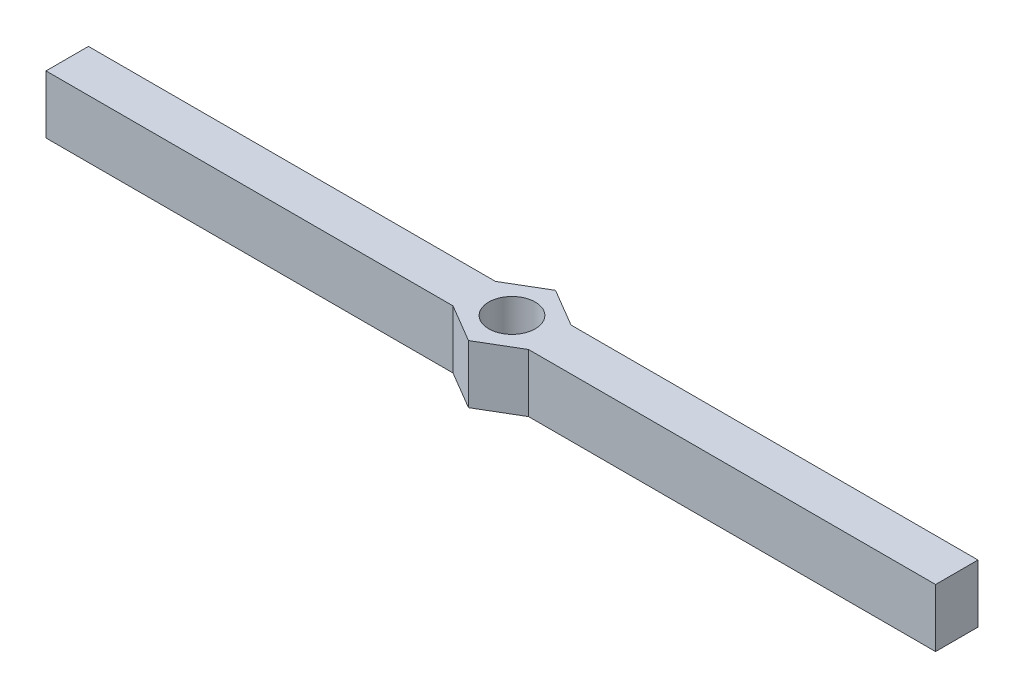
ISO-10303-21;
HEADER;
FILE_DESCRIPTION(('STEP AP214'),'2;1');
FILE_NAME('part.step','',(''),(''),'','','');
FILE_SCHEMA(('AUTOMOTIVE_DESIGN { 1 0 10303 214 1 1 1 1 }'));
ENDSEC;
DATA;
#1=APPLICATION_CONTEXT('core data for automotive mechanical design processes');
#2=APPLICATION_PROTOCOL_DEFINITION('international standard','automotive_design',2000,#1);
#3=PRODUCT_CONTEXT('',#1,'mechanical');
#4=PRODUCT('Part','Part','',(#3));
#5=PRODUCT_RELATED_PRODUCT_CATEGORY('part','',(#4));
#6=PRODUCT_DEFINITION_FORMATION('','',#4);
#7=PRODUCT_DEFINITION_CONTEXT('part definition',#1,'design');
#8=PRODUCT_DEFINITION('design','',#6,#7);
#9=PRODUCT_DEFINITION_SHAPE('','',#8);
#10=(LENGTH_UNIT() NAMED_UNIT(*) SI_UNIT(.MILLI.,.METRE.));
#11=(NAMED_UNIT(*) PLANE_ANGLE_UNIT() SI_UNIT($,.RADIAN.));
#12=(NAMED_UNIT(*) SI_UNIT($,.STERADIAN.) SOLID_ANGLE_UNIT());
#13=UNCERTAINTY_MEASURE_WITH_UNIT(LENGTH_MEASURE(1.E-05),#10,'distance_accuracy_value','');
#14=(GEOMETRIC_REPRESENTATION_CONTEXT(3) GLOBAL_UNCERTAINTY_ASSIGNED_CONTEXT((#13)) GLOBAL_UNIT_ASSIGNED_CONTEXT((#10,
#11,#12)) REPRESENTATION_CONTEXT('',''));
#15=CARTESIAN_POINT('',(0.,0.,0.));
#16=DIRECTION('',(0.,0.,1.));
#17=DIRECTION('',(1.,0.,0.));
#18=AXIS2_PLACEMENT_3D('',#15,#16,#17);
#19=CARTESIAN_POINT('',(-76.5008249027898,10.,-2.03693710594803E-12));
#20=DIRECTION('',(-1.,0.,0.));
#21=DIRECTION('',(0.,0.,1.));
#22=AXIS2_PLACEMENT_3D('',#19,#20,#21);
#23=PLANE('',#22);
#24=DIRECTION('',(0.,0.,-1.));
#25=VECTOR('',#24,1.);
#26=CARTESIAN_POINT('',(-76.5008249027898,0.,-2.03693710594803E-12));
#27=LINE('',#26,#25);
#28=CARTESIAN_POINT('',(-76.5008249027899,0.,3.64843641178938));
#29=VERTEX_POINT('',#28);
#30=CARTESIAN_POINT('',(-76.5008249027897,0.,-3.6484364117895));
#31=VERTEX_POINT('',#30);
#32=EDGE_CURVE('E148',#29,#31,#27,.T.);
#33=ORIENTED_EDGE('',*,*,#32,.F.);
#34=DIRECTION('',(0.,-1.,0.));
#35=VECTOR('',#34,1.);
#36=CARTESIAN_POINT('',(-76.5008249027899,10.,3.64843641178938));
#37=LINE('',#36,#35);
#38=CARTESIAN_POINT('',(-76.5008249027899,10.,3.64843641178938));
#39=VERTEX_POINT('',#38);
#40=EDGE_CURVE('E11',#39,#29,#37,.T.);
#41=ORIENTED_EDGE('',*,*,#40,.F.);
#42=DIRECTION('',(0.,0.,-1.));
#43=VECTOR('',#42,1.);
#44=CARTESIAN_POINT('',(-76.5008249027898,10.,-2.03693710594803E-12));
#45=LINE('',#44,#43);
#46=CARTESIAN_POINT('',(-76.5008249027897,10.,-3.6484364117895));
#47=VERTEX_POINT('',#46);
#48=EDGE_CURVE('E175',#39,#47,#45,.T.);
#49=ORIENTED_EDGE('',*,*,#48,.T.);
#50=DIRECTION('',(0.,-1.,0.));
#51=VECTOR('',#50,1.);
#52=CARTESIAN_POINT('',(-76.5008249027897,10.,-3.6484364117895));
#53=LINE('',#52,#51);
#54=EDGE_CURVE('E95',#47,#31,#53,.T.);
#55=ORIENTED_EDGE('',*,*,#54,.T.);
#56=EDGE_LOOP('',(#33,#41,#49,#55));
#57=FACE_BOUND('',#56,.T.);
#58=ADVANCED_FACE('F39',(#57),#23,.T.);
#59=CARTESIAN_POINT('',(0.,10.,3.6484364117913));
#60=DIRECTION('',(0.,0.,1.));
#61=DIRECTION('',(1.,0.,0.));
#62=AXIS2_PLACEMENT_3D('',#59,#60,#61);
#63=PLANE('',#62);
#64=DIRECTION('',(-1.,0.,0.));
#65=VECTOR('',#64,1.);
#66=CARTESIAN_POINT('',(0.,0.,3.6484364117913));
#67=LINE('',#66,#65);
#68=CARTESIAN_POINT('',(-6.50082490279077,0.,3.64843641178945));
#69=VERTEX_POINT('',#68);
#70=EDGE_CURVE('E151',#69,#29,#67,.T.);
#71=ORIENTED_EDGE('',*,*,#70,.F.);
#72=DIRECTION('',(0.,-1.,0.));
#73=VECTOR('',#72,1.);
#74=CARTESIAN_POINT('',(-6.50082490279077,10.,3.64843641178945));
#75=LINE('',#74,#73);
#76=CARTESIAN_POINT('',(-6.50082490279077,10.,3.64843641178945));
#77=VERTEX_POINT('',#76);
#78=EDGE_CURVE('E47',#77,#69,#75,.T.);
#79=ORIENTED_EDGE('',*,*,#78,.F.);
#80=DIRECTION('',(-1.,0.,0.));
#81=VECTOR('',#80,1.);
#82=CARTESIAN_POINT('',(0.,10.,3.6484364117913));
#83=LINE('',#82,#81);
#84=EDGE_CURVE('E204',#77,#39,#83,.T.);
#85=ORIENTED_EDGE('',*,*,#84,.T.);
#86=ORIENTED_EDGE('',*,*,#40,.T.);
#87=EDGE_LOOP('',(#71,#79,#85,#86));
#88=FACE_BOUND('',#87,.T.);
#89=ADVANCED_FACE('F203',(#88),#63,.T.);
#90=CARTESIAN_POINT('',(-3.274592558863,10.,5.55146497654283));
#91=DIRECTION('',(0.508060035822539,0.,-0.861321658847611));
#92=DIRECTION('',(-0.861321658847611,0.,-0.508060035822539));
#93=AXIS2_PLACEMENT_3D('',#90,#91,#92);
#94=PLANE('',#93);
#95=DIRECTION('',(0.861321658847611,0.,0.508060035822539));
#96=VECTOR('',#95,1.);
#97=CARTESIAN_POINT('',(-3.274592558863,0.,5.55146497654283));
#98=LINE('',#97,#96);
#99=CARTESIAN_POINT('',(0.,0.,7.48301934496086));
#100=VERTEX_POINT('',#99);
#101=EDGE_CURVE('E154',#69,#100,#98,.T.);
#102=ORIENTED_EDGE('',*,*,#101,.T.);
#103=DIRECTION('',(0.,-1.,0.));
#104=VECTOR('',#103,1.);
#105=CARTESIAN_POINT('',(0.,10.,7.48301934496086));
#106=LINE('',#105,#104);
#107=CARTESIAN_POINT('',(0.,10.,7.48301934496086));
#108=VERTEX_POINT('',#107);
#109=EDGE_CURVE('E186',#108,#100,#106,.T.);
#110=ORIENTED_EDGE('',*,*,#109,.F.);
#111=DIRECTION('',(0.861321658847611,0.,0.508060035822539));
#112=VECTOR('',#111,1.);
#113=CARTESIAN_POINT('',(-3.274592558863,10.,5.55146497654283));
#114=LINE('',#113,#112);
#115=EDGE_CURVE('E193',#77,#108,#114,.T.);
#116=ORIENTED_EDGE('',*,*,#115,.F.);
#117=ORIENTED_EDGE('',*,*,#78,.T.);
#118=EDGE_LOOP('',(#102,#110,#116,#117));
#119=FACE_BOUND('',#118,.T.);
#120=ADVANCED_FACE('F191',(#119),#94,.F.);
#121=CARTESIAN_POINT('',(3.274592558863,10.,5.55146497654283));
#122=DIRECTION('',(-0.50806003582254,0.,-0.861321658847611));
#123=DIRECTION('',(-0.861321658847611,0.,0.50806003582254));
#124=AXIS2_PLACEMENT_3D('',#121,#122,#123);
#125=PLANE('',#124);
#126=DIRECTION('',(0.861321658847611,0.,-0.50806003582254));
#127=VECTOR('',#126,1.);
#128=CARTESIAN_POINT('',(3.274592558863,0.,5.55146497654283));
#129=LINE('',#128,#127);
#130=CARTESIAN_POINT('',(6.50082490279077,0.,3.64843641178944));
#131=VERTEX_POINT('',#130);
#132=EDGE_CURVE('E156',#100,#131,#129,.T.);
#133=ORIENTED_EDGE('',*,*,#132,.T.);
#134=DIRECTION('',(0.,-1.,0.));
#135=VECTOR('',#134,1.);
#136=CARTESIAN_POINT('',(6.50082490279077,10.,3.64843641178944));
#137=LINE('',#136,#135);
#138=CARTESIAN_POINT('',(6.50082490279077,10.,3.64843641178944));
#139=VERTEX_POINT('',#138);
#140=EDGE_CURVE('E183',#139,#131,#137,.T.);
#141=ORIENTED_EDGE('',*,*,#140,.F.);
#142=DIRECTION('',(0.861321658847611,0.,-0.50806003582254));
#143=VECTOR('',#142,1.);
#144=CARTESIAN_POINT('',(3.274592558863,10.,5.55146497654283));
#145=LINE('',#144,#143);
#146=EDGE_CURVE('E210',#108,#139,#145,.T.);
#147=ORIENTED_EDGE('',*,*,#146,.F.);
#148=ORIENTED_EDGE('',*,*,#109,.T.);
#149=EDGE_LOOP('',(#133,#141,#147,#148));
#150=FACE_BOUND('',#149,.T.);
#151=ADVANCED_FACE('F229',(#150),#125,.F.);
#152=CARTESIAN_POINT('',(0.,10.,3.64843641178944));
#153=DIRECTION('',(0.,0.,-1.));
#154=DIRECTION('',(-1.,0.,0.));
#155=AXIS2_PLACEMENT_3D('',#152,#153,#154);
#156=PLANE('',#155);
#157=DIRECTION('',(1.,0.,0.));
#158=VECTOR('',#157,1.);
#159=CARTESIAN_POINT('',(0.,0.,3.64843641178944));
#160=LINE('',#159,#158);
#161=CARTESIAN_POINT('',(76.5008249027908,0.,3.64843641178944));
#162=VERTEX_POINT('',#161);
#163=EDGE_CURVE('E158',#131,#162,#160,.T.);
#164=ORIENTED_EDGE('',*,*,#163,.T.);
#165=DIRECTION('',(0.,-1.,0.));
#166=VECTOR('',#165,1.);
#167=CARTESIAN_POINT('',(76.5008249027908,10.,3.64843641178944));
#168=LINE('',#167,#166);
#169=CARTESIAN_POINT('',(76.5008249027908,10.,3.64843641178944));
#170=VERTEX_POINT('',#169);
#171=EDGE_CURVE('E181',#170,#162,#168,.T.);
#172=ORIENTED_EDGE('',*,*,#171,.F.);
#173=DIRECTION('',(1.,0.,0.));
#174=VECTOR('',#173,1.);
#175=CARTESIAN_POINT('',(0.,10.,3.64843641178944));
#176=LINE('',#175,#174);
#177=EDGE_CURVE('E212',#139,#170,#176,.T.);
#178=ORIENTED_EDGE('',*,*,#177,.F.);
#179=ORIENTED_EDGE('',*,*,#140,.T.);
#180=EDGE_LOOP('',(#164,#172,#178,#179));
#181=FACE_BOUND('',#180,.T.);
#182=ADVANCED_FACE('F225',(#181),#156,.F.);
#183=CARTESIAN_POINT('',(76.5008249027908,10.,0.));
#184=DIRECTION('',(1.,0.,0.));
#185=DIRECTION('',(0.,0.,-1.));
#186=AXIS2_PLACEMENT_3D('',#183,#184,#185);
#187=PLANE('',#186);
#188=DIRECTION('',(0.,0.,1.));
#189=VECTOR('',#188,1.);
#190=CARTESIAN_POINT('',(76.5008249027908,0.,0.));
#191=LINE('',#190,#189);
#192=CARTESIAN_POINT('',(76.5008249027908,0.,-3.64843641178944));
#193=VERTEX_POINT('',#192);
#194=EDGE_CURVE('E161',#193,#162,#191,.T.);
#195=ORIENTED_EDGE('',*,*,#194,.F.);
#196=DIRECTION('',(0.,-1.,0.));
#197=VECTOR('',#196,1.);
#198=CARTESIAN_POINT('',(76.5008249027908,10.,-3.64843641178944));
#199=LINE('',#198,#197);
#200=CARTESIAN_POINT('',(76.5008249027908,10.,-3.64843641178944));
#201=VERTEX_POINT('',#200);
#202=EDGE_CURVE('E179',#201,#193,#199,.T.);
#203=ORIENTED_EDGE('',*,*,#202,.F.);
#204=DIRECTION('',(0.,0.,1.));
#205=VECTOR('',#204,1.);
#206=CARTESIAN_POINT('',(76.5008249027908,10.,0.));
#207=LINE('',#206,#205);
#208=EDGE_CURVE('E214',#201,#170,#207,.T.);
#209=ORIENTED_EDGE('',*,*,#208,.T.);
#210=ORIENTED_EDGE('',*,*,#171,.T.);
#211=EDGE_LOOP('',(#195,#203,#209,#210));
#212=FACE_BOUND('',#211,.T.);
#213=ADVANCED_FACE('F221',(#212),#187,.T.);
#214=CARTESIAN_POINT('',(0.,10.,-3.64843641178945));
#215=DIRECTION('',(0.,0.,-1.));
#216=DIRECTION('',(-1.,0.,0.));
#217=AXIS2_PLACEMENT_3D('',#214,#215,#216);
#218=PLANE('',#217);
#219=DIRECTION('',(1.,0.,0.));
#220=VECTOR('',#219,1.);
#221=CARTESIAN_POINT('',(0.,0.,-3.64843641178945));
#222=LINE('',#221,#220);
#223=CARTESIAN_POINT('',(6.50082490279077,0.,-3.64843641178945));
#224=VERTEX_POINT('',#223);
#225=EDGE_CURVE('E164',#224,#193,#222,.T.);
#226=ORIENTED_EDGE('',*,*,#225,.F.);
#227=DIRECTION('',(0.,-1.,0.));
#228=VECTOR('',#227,1.);
#229=CARTESIAN_POINT('',(6.50082490279077,10.,-3.64843641178945));
#230=LINE('',#229,#228);
#231=CARTESIAN_POINT('',(6.50082490279077,10.,-3.64843641178945));
#232=VERTEX_POINT('',#231);
#233=EDGE_CURVE('E130',#232,#224,#230,.T.);
#234=ORIENTED_EDGE('',*,*,#233,.F.);
#235=DIRECTION('',(1.,0.,0.));
#236=VECTOR('',#235,1.);
#237=CARTESIAN_POINT('',(0.,10.,-3.64843641178945));
#238=LINE('',#237,#236);
#239=EDGE_CURVE('E138',#232,#201,#238,.T.);
#240=ORIENTED_EDGE('',*,*,#239,.T.);
#241=ORIENTED_EDGE('',*,*,#202,.T.);
#242=EDGE_LOOP('',(#226,#234,#240,#241));
#243=FACE_BOUND('',#242,.T.);
#244=ADVANCED_FACE('F218',(#243),#218,.T.);
#245=CARTESIAN_POINT('',(3.274592558863,10.,-5.55146497654283));
#246=DIRECTION('',(0.50806003582254,0.,-0.861321658847611));
#247=DIRECTION('',(-0.861321658847611,0.,-0.50806003582254));
#248=AXIS2_PLACEMENT_3D('',#245,#246,#247);
#249=PLANE('',#248);
#250=DIRECTION('',(0.861321658847611,0.,0.50806003582254));
#251=VECTOR('',#250,1.);
#252=CARTESIAN_POINT('',(3.274592558863,0.,-5.55146497654283));
#253=LINE('',#252,#251);
#254=CARTESIAN_POINT('',(0.,0.,-7.48301934496085));
#255=VERTEX_POINT('',#254);
#256=EDGE_CURVE('E125',#255,#224,#253,.T.);
#257=ORIENTED_EDGE('',*,*,#256,.F.);
#258=DIRECTION('',(0.,-1.,0.));
#259=VECTOR('',#258,1.);
#260=CARTESIAN_POINT('',(0.,10.,-7.48301934496085));
#261=LINE('',#260,#259);
#262=CARTESIAN_POINT('',(0.,10.,-7.48301934496085));
#263=VERTEX_POINT('',#262);
#264=EDGE_CURVE('E120',#263,#255,#261,.T.);
#265=ORIENTED_EDGE('',*,*,#264,.F.);
#266=DIRECTION('',(0.861321658847611,0.,0.50806003582254));
#267=VECTOR('',#266,1.);
#268=CARTESIAN_POINT('',(3.274592558863,10.,-5.55146497654283));
#269=LINE('',#268,#267);
#270=EDGE_CURVE('E123',#263,#232,#269,.T.);
#271=ORIENTED_EDGE('',*,*,#270,.T.);
#272=ORIENTED_EDGE('',*,*,#233,.T.);
#273=EDGE_LOOP('',(#257,#265,#271,#272));
#274=FACE_BOUND('',#273,.T.);
#275=ADVANCED_FACE('F122',(#274),#249,.T.);
#276=CARTESIAN_POINT('',(-3.274592558863,10.,-5.55146497654283));
#277=DIRECTION('',(-0.508060035822539,0.,-0.861321658847611));
#278=DIRECTION('',(-0.861321658847611,0.,0.508060035822539));
#279=AXIS2_PLACEMENT_3D('',#276,#277,#278);
#280=PLANE('',#279);
#281=DIRECTION('',(0.861321658847611,0.,-0.508060035822539));
#282=VECTOR('',#281,1.);
#283=CARTESIAN_POINT('',(-3.274592558863,0.,-5.55146497654283));
#284=LINE('',#283,#282);
#285=CARTESIAN_POINT('',(-6.50082490279077,0.,-3.64843641178944));
#286=VERTEX_POINT('',#285);
#287=EDGE_CURVE('E168',#286,#255,#284,.T.);
#288=ORIENTED_EDGE('',*,*,#287,.F.);
#289=DIRECTION('',(0.,-1.,0.));
#290=VECTOR('',#289,1.);
#291=CARTESIAN_POINT('',(-6.50082490279077,10.,-3.64843641178944));
#292=LINE('',#291,#290);
#293=CARTESIAN_POINT('',(-6.50082490279077,10.,-3.64843641178944));
#294=VERTEX_POINT('',#293);
#295=EDGE_CURVE('E88',#294,#286,#292,.T.);
#296=ORIENTED_EDGE('',*,*,#295,.F.);
#297=DIRECTION('',(0.861321658847611,0.,-0.508060035822539));
#298=VECTOR('',#297,1.);
#299=CARTESIAN_POINT('',(-3.274592558863,10.,-5.55146497654283));
#300=LINE('',#299,#298);
#301=EDGE_CURVE('E135',#294,#263,#300,.T.);
#302=ORIENTED_EDGE('',*,*,#301,.T.);
#303=ORIENTED_EDGE('',*,*,#264,.T.);
#304=EDGE_LOOP('',(#288,#296,#302,#303));
#305=FACE_BOUND('',#304,.T.);
#306=ADVANCED_FACE('F140',(#305),#280,.T.);
#307=CARTESIAN_POINT('',(0.,10.,-3.64843641178759));
#308=DIRECTION('',(0.,0.,1.));
#309=DIRECTION('',(1.,0.,0.));
#310=AXIS2_PLACEMENT_3D('',#307,#308,#309);
#311=PLANE('',#310);
#312=DIRECTION('',(-1.,0.,0.));
#313=VECTOR('',#312,1.);
#314=CARTESIAN_POINT('',(0.,0.,-3.64843641178759));
#315=LINE('',#314,#313);
#316=EDGE_CURVE('E170',#286,#31,#315,.T.);
#317=ORIENTED_EDGE('',*,*,#316,.T.);
#318=ORIENTED_EDGE('',*,*,#54,.F.);
#319=DIRECTION('',(-1.,0.,0.));
#320=VECTOR('',#319,1.);
#321=CARTESIAN_POINT('',(0.,10.,-3.64843641178759));
#322=LINE('',#321,#320);
#323=EDGE_CURVE('E55',#294,#47,#322,.T.);
#324=ORIENTED_EDGE('',*,*,#323,.F.);
#325=ORIENTED_EDGE('',*,*,#295,.T.);
#326=EDGE_LOOP('',(#317,#318,#324,#325));
#327=FACE_BOUND('',#326,.T.);
#328=ADVANCED_FACE('F205',(#327),#311,.F.);
#329=CARTESIAN_POINT('',(0.,10.,0.));
#330=DIRECTION('',(0.,-1.,0.));
#331=DIRECTION('',(0.,0.,-1.));
#332=AXIS2_PLACEMENT_3D('',#329,#330,#331);
#333=CYLINDRICAL_SURFACE('',#332,4.);
#334=CARTESIAN_POINT('',(0.,10.,0.));
#335=DIRECTION('',(0.,1.,0.));
#336=DIRECTION('',(0.,0.,1.));
#337=AXIS2_PLACEMENT_3D('',#334,#335,#336);
#338=CIRCLE('',#337,4.);
#339=CARTESIAN_POINT('',(0.,10.,4.));
#340=VERTEX_POINT('',#339);
#341=EDGE_CURVE('E142',#340,#340,#338,.T.);
#342=ORIENTED_EDGE('',*,*,#341,.T.);
#343=EDGE_LOOP('',(#342));
#344=FACE_BOUND('',#343,.T.);
#345=CARTESIAN_POINT('',(0.,0.,0.));
#346=DIRECTION('',(0.,1.,0.));
#347=DIRECTION('',(0.,0.,1.));
#348=AXIS2_PLACEMENT_3D('',#345,#346,#347);
#349=CIRCLE('',#348,4.);
#350=CARTESIAN_POINT('',(0.,0.,4.));
#351=VERTEX_POINT('',#350);
#352=EDGE_CURVE('E172',#351,#351,#349,.T.);
#353=ORIENTED_EDGE('',*,*,#352,.F.);
#354=EDGE_LOOP('',(#353));
#355=FACE_BOUND('',#354,.T.);
#356=ADVANCED_FACE('F299',(#344,#355),#333,.F.);
#357=CARTESIAN_POINT('',(0.,10.,0.));
#358=DIRECTION('',(0.,1.,0.));
#359=DIRECTION('',(0.,0.,1.));
#360=AXIS2_PLACEMENT_3D('',#357,#358,#359);
#361=PLANE('',#360);
#362=ORIENTED_EDGE('',*,*,#48,.F.);
#363=ORIENTED_EDGE('',*,*,#84,.F.);
#364=ORIENTED_EDGE('',*,*,#115,.T.);
#365=ORIENTED_EDGE('',*,*,#146,.T.);
#366=ORIENTED_EDGE('',*,*,#177,.T.);
#367=ORIENTED_EDGE('',*,*,#208,.F.);
#368=ORIENTED_EDGE('',*,*,#239,.F.);
#369=ORIENTED_EDGE('',*,*,#270,.F.);
#370=ORIENTED_EDGE('',*,*,#301,.F.);
#371=ORIENTED_EDGE('',*,*,#323,.T.);
#372=EDGE_LOOP('',(#362,#363,#364,#365,#366,#367,#368,#369,#370,#371));
#373=FACE_BOUND('',#372,.T.);
#374=ORIENTED_EDGE('',*,*,#341,.F.);
#375=EDGE_LOOP('',(#374));
#376=FACE_BOUND('',#375,.T.);
#377=ADVANCED_FACE('F133',(#373,#376),#361,.T.);
#378=CARTESIAN_POINT('',(0.,0.,0.));
#379=DIRECTION('',(0.,1.,0.));
#380=DIRECTION('',(0.,0.,1.));
#381=AXIS2_PLACEMENT_3D('',#378,#379,#380);
#382=PLANE('',#381);
#383=ORIENTED_EDGE('',*,*,#32,.T.);
#384=ORIENTED_EDGE('',*,*,#316,.F.);
#385=ORIENTED_EDGE('',*,*,#287,.T.);
#386=ORIENTED_EDGE('',*,*,#256,.T.);
#387=ORIENTED_EDGE('',*,*,#225,.T.);
#388=ORIENTED_EDGE('',*,*,#194,.T.);
#389=ORIENTED_EDGE('',*,*,#163,.F.);
#390=ORIENTED_EDGE('',*,*,#132,.F.);
#391=ORIENTED_EDGE('',*,*,#101,.F.);
#392=ORIENTED_EDGE('',*,*,#70,.T.);
#393=EDGE_LOOP('',(#383,#384,#385,#386,#387,#388,#389,#390,#391,#392));
#394=FACE_BOUND('',#393,.T.);
#395=ORIENTED_EDGE('',*,*,#352,.T.);
#396=EDGE_LOOP('',(#395));
#397=FACE_BOUND('',#396,.T.);
#398=ADVANCED_FACE('F200',(#394,#397),#382,.F.);
#399=CLOSED_SHELL('',(#58,#89,#120,#151,#182,#213,#244,#275,#306,#328,#356,#377,#398));
#400=MANIFOLD_SOLID_BREP('B2',#399);
#401=ADVANCED_BREP_SHAPE_REPRESENTATION('',(#18,#400),#14);
#402=SHAPE_DEFINITION_REPRESENTATION(#9,#401);
ENDSEC;
END-ISO-10303-21;
